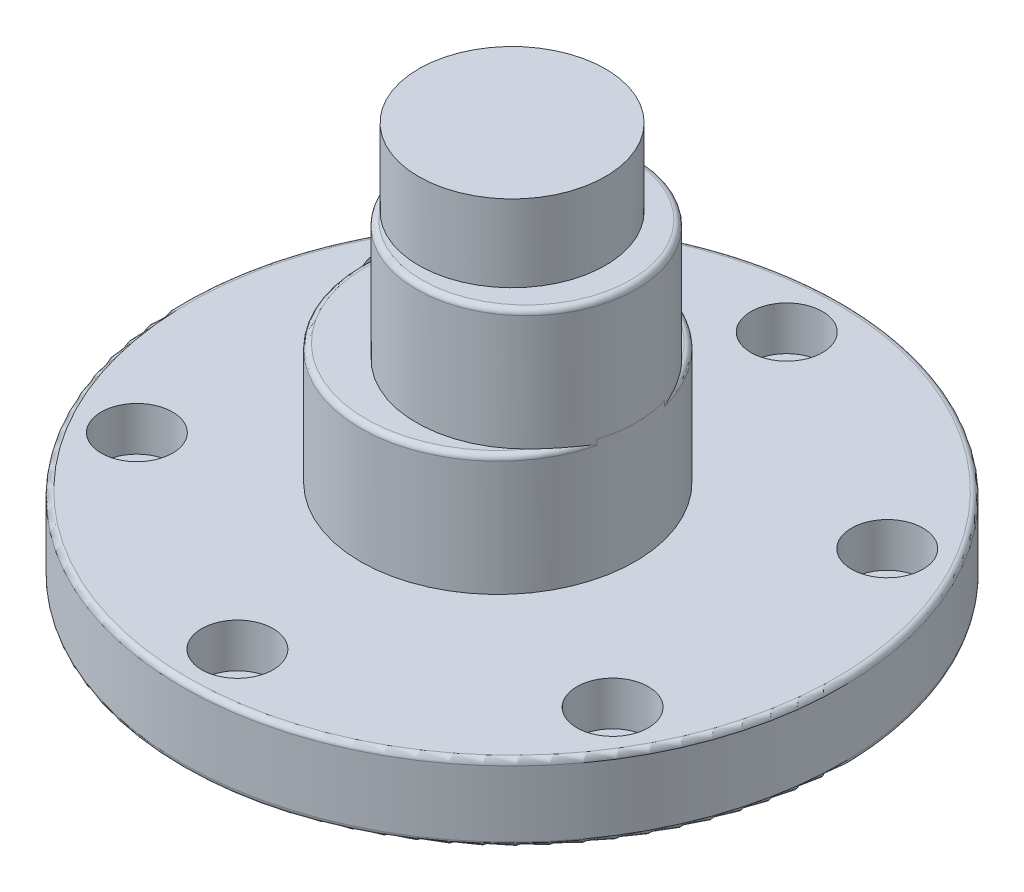
ISO-10303-21;
HEADER;
FILE_DESCRIPTION(('STEP AP214'),'2;1');
FILE_NAME('part.step','',(''),(''),'','','');
FILE_SCHEMA(('AUTOMOTIVE_DESIGN { 1 0 10303 214 1 1 1 1 }'));
ENDSEC;
DATA;
#1=APPLICATION_CONTEXT('core data for automotive mechanical design processes');
#2=APPLICATION_PROTOCOL_DEFINITION('international standard','automotive_design',2000,#1);
#3=PRODUCT_CONTEXT('',#1,'mechanical');
#4=PRODUCT('Part','Part','',(#3));
#5=PRODUCT_RELATED_PRODUCT_CATEGORY('part','',(#4));
#6=PRODUCT_DEFINITION_FORMATION('','',#4);
#7=PRODUCT_DEFINITION_CONTEXT('part definition',#1,'design');
#8=PRODUCT_DEFINITION('design','',#6,#7);
#9=PRODUCT_DEFINITION_SHAPE('','',#8);
#10=(LENGTH_UNIT() NAMED_UNIT(*) SI_UNIT(.MILLI.,.METRE.));
#11=(NAMED_UNIT(*) PLANE_ANGLE_UNIT() SI_UNIT($,.RADIAN.));
#12=(NAMED_UNIT(*) SI_UNIT($,.STERADIAN.) SOLID_ANGLE_UNIT());
#13=UNCERTAINTY_MEASURE_WITH_UNIT(LENGTH_MEASURE(1.E-05),#10,'distance_accuracy_value','');
#14=(GEOMETRIC_REPRESENTATION_CONTEXT(3) GLOBAL_UNCERTAINTY_ASSIGNED_CONTEXT((#13)) GLOBAL_UNIT_ASSIGNED_CONTEXT((#10,
#11,#12)) REPRESENTATION_CONTEXT('',''));
#15=CARTESIAN_POINT('',(0.,0.,0.));
#16=DIRECTION('',(0.,0.,1.));
#17=DIRECTION('',(1.,0.,0.));
#18=AXIS2_PLACEMENT_3D('',#15,#16,#17);
#19=CARTESIAN_POINT('',(0.,7.,-25.));
#20=DIRECTION('',(0.,-1.,0.));
#21=DIRECTION('',(0.,0.,-1.));
#22=AXIS2_PLACEMENT_3D('',#19,#20,#21);
#23=CYLINDRICAL_SURFACE('',#22,2.05);
#24=CARTESIAN_POINT('',(0.,0.,-25.));
#25=DIRECTION('',(0.,1.,0.));
#26=DIRECTION('',(0.,0.,1.));
#27=AXIS2_PLACEMENT_3D('',#24,#25,#26);
#28=CIRCLE('',#27,2.05);
#29=CARTESIAN_POINT('',(0.,0.,-22.95));
#30=VERTEX_POINT('',#29);
#31=EDGE_CURVE('E154',#30,#30,#28,.T.);
#32=ORIENTED_EDGE('',*,*,#31,.F.);
#33=EDGE_LOOP('',(#32));
#34=FACE_BOUND('',#33,.T.);
#35=CARTESIAN_POINT('',(0.,3.,-25.));
#36=DIRECTION('',(0.,1.,0.));
#37=DIRECTION('',(0.,0.,1.));
#38=AXIS2_PLACEMENT_3D('',#35,#36,#37);
#39=CIRCLE('',#38,2.05);
#40=CARTESIAN_POINT('',(0.,3.,-22.95));
#41=VERTEX_POINT('',#40);
#42=EDGE_CURVE('E36',#41,#41,#39,.T.);
#43=ORIENTED_EDGE('',*,*,#42,.T.);
#44=EDGE_LOOP('',(#43));
#45=FACE_BOUND('',#44,.T.);
#46=ADVANCED_FACE('F32',(#34,#45),#23,.F.);
#47=CARTESIAN_POINT('',(21.6506350946115,7.,-12.5000000000009));
#48=DIRECTION('',(0.,-1.,0.));
#49=DIRECTION('',(0.,0.,-1.));
#50=AXIS2_PLACEMENT_3D('',#47,#48,#49);
#51=CYLINDRICAL_SURFACE('',#50,2.05);
#52=CARTESIAN_POINT('',(21.6506350946115,0.,-12.5000000000009));
#53=DIRECTION('',(0.,1.,0.));
#54=DIRECTION('',(0.,0.,1.));
#55=AXIS2_PLACEMENT_3D('',#52,#53,#54);
#56=CIRCLE('',#55,2.05);
#57=CARTESIAN_POINT('',(21.6506350946115,0.,-10.4500000000009));
#58=VERTEX_POINT('',#57);
#59=EDGE_CURVE('E151',#58,#58,#56,.T.);
#60=ORIENTED_EDGE('',*,*,#59,.F.);
#61=EDGE_LOOP('',(#60));
#62=FACE_BOUND('',#61,.T.);
#63=CARTESIAN_POINT('',(21.6506350946115,3.,-12.5000000000009));
#64=DIRECTION('',(0.,1.,0.));
#65=DIRECTION('',(0.,0.,1.));
#66=AXIS2_PLACEMENT_3D('',#63,#64,#65);
#67=CIRCLE('',#66,2.05);
#68=CARTESIAN_POINT('',(21.6506350946115,3.,-10.4500000000009));
#69=VERTEX_POINT('',#68);
#70=EDGE_CURVE('E279',#69,#69,#67,.T.);
#71=ORIENTED_EDGE('',*,*,#70,.T.);
#72=EDGE_LOOP('',(#71));
#73=FACE_BOUND('',#72,.T.);
#74=ADVANCED_FACE('F213',(#62,#73),#51,.F.);
#75=CARTESIAN_POINT('',(21.6506350946126,7.,12.4999999999991));
#76=DIRECTION('',(0.,-1.,0.));
#77=DIRECTION('',(0.,0.,-1.));
#78=AXIS2_PLACEMENT_3D('',#75,#76,#77);
#79=CYLINDRICAL_SURFACE('',#78,2.05);
#80=CARTESIAN_POINT('',(21.6506350946126,0.,12.4999999999991));
#81=DIRECTION('',(0.,1.,0.));
#82=DIRECTION('',(0.,0.,1.));
#83=AXIS2_PLACEMENT_3D('',#80,#81,#82);
#84=CIRCLE('',#83,2.05);
#85=CARTESIAN_POINT('',(21.6506350946126,0.,14.5499999999991));
#86=VERTEX_POINT('',#85);
#87=EDGE_CURVE('E148',#86,#86,#84,.T.);
#88=ORIENTED_EDGE('',*,*,#87,.F.);
#89=EDGE_LOOP('',(#88));
#90=FACE_BOUND('',#89,.T.);
#91=CARTESIAN_POINT('',(21.6506350946126,3.,12.4999999999991));
#92=DIRECTION('',(0.,1.,0.));
#93=DIRECTION('',(0.,0.,1.));
#94=AXIS2_PLACEMENT_3D('',#91,#92,#93);
#95=CIRCLE('',#94,2.05);
#96=CARTESIAN_POINT('',(21.6506350946126,3.,14.5499999999991));
#97=VERTEX_POINT('',#96);
#98=EDGE_CURVE('E277',#97,#97,#95,.T.);
#99=ORIENTED_EDGE('',*,*,#98,.T.);
#100=EDGE_LOOP('',(#99));
#101=FACE_BOUND('',#100,.T.);
#102=ADVANCED_FACE('F219',(#90,#101),#79,.F.);
#103=CARTESIAN_POINT('',(2.1224433562867E-12,7.,25.));
#104=DIRECTION('',(0.,-1.,0.));
#105=DIRECTION('',(0.,0.,-1.));
#106=AXIS2_PLACEMENT_3D('',#103,#104,#105);
#107=CYLINDRICAL_SURFACE('',#106,2.05);
#108=CARTESIAN_POINT('',(2.1224433562867E-12,0.,25.));
#109=DIRECTION('',(0.,1.,0.));
#110=DIRECTION('',(0.,0.,1.));
#111=AXIS2_PLACEMENT_3D('',#108,#109,#110);
#112=CIRCLE('',#111,2.05);
#113=CARTESIAN_POINT('',(2.1224433562867E-12,0.,27.05));
#114=VERTEX_POINT('',#113);
#115=EDGE_CURVE('E145',#114,#114,#112,.T.);
#116=ORIENTED_EDGE('',*,*,#115,.F.);
#117=EDGE_LOOP('',(#116));
#118=FACE_BOUND('',#117,.T.);
#119=CARTESIAN_POINT('',(2.1224433562867E-12,3.,25.));
#120=DIRECTION('',(0.,1.,0.));
#121=DIRECTION('',(0.,0.,1.));
#122=AXIS2_PLACEMENT_3D('',#119,#120,#121);
#123=CIRCLE('',#122,2.05);
#124=CARTESIAN_POINT('',(2.1224433562867E-12,3.,27.05));
#125=VERTEX_POINT('',#124);
#126=EDGE_CURVE('E280',#125,#125,#123,.T.);
#127=ORIENTED_EDGE('',*,*,#126,.T.);
#128=EDGE_LOOP('',(#127));
#129=FACE_BOUND('',#128,.T.);
#130=ADVANCED_FACE('F265',(#118,#129),#107,.F.);
#131=CARTESIAN_POINT('',(-21.6506350946094,7.,12.5000000000009));
#132=DIRECTION('',(0.,-1.,0.));
#133=DIRECTION('',(0.,0.,-1.));
#134=AXIS2_PLACEMENT_3D('',#131,#132,#133);
#135=CYLINDRICAL_SURFACE('',#134,2.05);
#136=CARTESIAN_POINT('',(-21.6506350946094,0.,12.5000000000009));
#137=DIRECTION('',(0.,1.,0.));
#138=DIRECTION('',(0.,0.,1.));
#139=AXIS2_PLACEMENT_3D('',#136,#137,#138);
#140=CIRCLE('',#139,2.05);
#141=CARTESIAN_POINT('',(-21.6506350946094,0.,14.5500000000009));
#142=VERTEX_POINT('',#141);
#143=EDGE_CURVE('E142',#142,#142,#140,.T.);
#144=ORIENTED_EDGE('',*,*,#143,.F.);
#145=EDGE_LOOP('',(#144));
#146=FACE_BOUND('',#145,.T.);
#147=CARTESIAN_POINT('',(-21.6506350946094,3.,12.5000000000009));
#148=DIRECTION('',(0.,1.,0.));
#149=DIRECTION('',(0.,0.,1.));
#150=AXIS2_PLACEMENT_3D('',#147,#148,#149);
#151=CIRCLE('',#150,2.05);
#152=CARTESIAN_POINT('',(-21.6506350946094,3.,14.5500000000009));
#153=VERTEX_POINT('',#152);
#154=EDGE_CURVE('E284',#153,#153,#151,.T.);
#155=ORIENTED_EDGE('',*,*,#154,.T.);
#156=EDGE_LOOP('',(#155));
#157=FACE_BOUND('',#156,.T.);
#158=ADVANCED_FACE('F261',(#146,#157),#135,.F.);
#159=CARTESIAN_POINT('',(-21.6506350946104,7.,-12.4999999999991));
#160=DIRECTION('',(0.,-1.,0.));
#161=DIRECTION('',(0.,0.,-1.));
#162=AXIS2_PLACEMENT_3D('',#159,#160,#161);
#163=CYLINDRICAL_SURFACE('',#162,2.05);
#164=CARTESIAN_POINT('',(-21.6506350946104,0.,-12.4999999999991));
#165=DIRECTION('',(0.,1.,0.));
#166=DIRECTION('',(0.,0.,1.));
#167=AXIS2_PLACEMENT_3D('',#164,#165,#166);
#168=CIRCLE('',#167,2.05);
#169=CARTESIAN_POINT('',(-21.6506350946104,0.,-10.4499999999991));
#170=VERTEX_POINT('',#169);
#171=EDGE_CURVE('E137',#170,#170,#168,.T.);
#172=ORIENTED_EDGE('',*,*,#171,.F.);
#173=EDGE_LOOP('',(#172));
#174=FACE_BOUND('',#173,.T.);
#175=CARTESIAN_POINT('',(-21.6506350946104,3.,-12.4999999999991));
#176=DIRECTION('',(0.,1.,0.));
#177=DIRECTION('',(0.,0.,1.));
#178=AXIS2_PLACEMENT_3D('',#175,#176,#177);
#179=CIRCLE('',#178,2.05);
#180=CARTESIAN_POINT('',(-21.6506350946104,3.,-10.4499999999991));
#181=VERTEX_POINT('',#180);
#182=EDGE_CURVE('E98',#181,#181,#179,.T.);
#183=ORIENTED_EDGE('',*,*,#182,.T.);
#184=EDGE_LOOP('',(#183));
#185=FACE_BOUND('',#184,.T.);
#186=ADVANCED_FACE('F230',(#174,#185),#163,.F.);
#187=CARTESIAN_POINT('',(0.,7.,0.));
#188=DIRECTION('',(0.,1.,0.));
#189=DIRECTION('',(0.,0.,1.));
#190=AXIS2_PLACEMENT_3D('',#187,#188,#189);
#191=PLANE('',#190);
#192=CARTESIAN_POINT('',(0.,7.,-25.));
#193=DIRECTION('',(0.,1.,0.));
#194=DIRECTION('',(0.,0.,1.));
#195=AXIS2_PLACEMENT_3D('',#192,#193,#194);
#196=CIRCLE('',#195,3.25);
#197=CARTESIAN_POINT('',(0.,7.,-21.75));
#198=VERTEX_POINT('',#197);
#199=EDGE_CURVE('E99',#198,#198,#196,.T.);
#200=ORIENTED_EDGE('',*,*,#199,.F.);
#201=EDGE_LOOP('',(#200));
#202=FACE_BOUND('',#201,.T.);
#203=CARTESIAN_POINT('',(-21.6506350946104,7.,-12.4999999999991));
#204=DIRECTION('',(0.,1.,0.));
#205=DIRECTION('',(0.,0.,1.));
#206=AXIS2_PLACEMENT_3D('',#203,#204,#205);
#207=CIRCLE('',#206,3.25);
#208=CARTESIAN_POINT('',(-21.6506350946104,7.,-9.24999999999906));
#209=VERTEX_POINT('',#208);
#210=EDGE_CURVE('E92',#209,#209,#207,.T.);
#211=ORIENTED_EDGE('',*,*,#210,.F.);
#212=EDGE_LOOP('',(#211));
#213=FACE_BOUND('',#212,.T.);
#214=CARTESIAN_POINT('',(-21.6506350946094,7.,12.5000000000009));
#215=DIRECTION('',(0.,1.,0.));
#216=DIRECTION('',(0.,0.,1.));
#217=AXIS2_PLACEMENT_3D('',#214,#215,#216);
#218=CIRCLE('',#217,3.25);
#219=CARTESIAN_POINT('',(-21.6506350946094,7.,15.7500000000009));
#220=VERTEX_POINT('',#219);
#221=EDGE_CURVE('E106',#220,#220,#218,.T.);
#222=ORIENTED_EDGE('',*,*,#221,.F.);
#223=EDGE_LOOP('',(#222));
#224=FACE_BOUND('',#223,.T.);
#225=CARTESIAN_POINT('',(2.1224433562867E-12,7.,25.));
#226=DIRECTION('',(0.,1.,0.));
#227=DIRECTION('',(0.,0.,1.));
#228=AXIS2_PLACEMENT_3D('',#225,#226,#227);
#229=CIRCLE('',#228,3.25);
#230=CARTESIAN_POINT('',(2.1224433562867E-12,7.,28.25));
#231=VERTEX_POINT('',#230);
#232=EDGE_CURVE('E123',#231,#231,#229,.T.);
#233=ORIENTED_EDGE('',*,*,#232,.F.);
#234=EDGE_LOOP('',(#233));
#235=FACE_BOUND('',#234,.T.);
#236=CARTESIAN_POINT('',(21.6506350946126,7.,12.4999999999991));
#237=DIRECTION('',(0.,1.,0.));
#238=DIRECTION('',(0.,0.,1.));
#239=AXIS2_PLACEMENT_3D('',#236,#237,#238);
#240=CIRCLE('',#239,3.25);
#241=CARTESIAN_POINT('',(21.6506350946126,7.,15.7499999999991));
#242=VERTEX_POINT('',#241);
#243=EDGE_CURVE('E117',#242,#242,#240,.T.);
#244=ORIENTED_EDGE('',*,*,#243,.F.);
#245=EDGE_LOOP('',(#244));
#246=FACE_BOUND('',#245,.T.);
#247=CARTESIAN_POINT('',(21.6506350946115,7.,-12.5000000000009));
#248=DIRECTION('',(0.,1.,0.));
#249=DIRECTION('',(0.,0.,1.));
#250=AXIS2_PLACEMENT_3D('',#247,#248,#249);
#251=CIRCLE('',#250,3.25);
#252=CARTESIAN_POINT('',(21.6506350946115,7.,-9.25000000000092));
#253=VERTEX_POINT('',#252);
#254=EDGE_CURVE('E111',#253,#253,#251,.T.);
#255=ORIENTED_EDGE('',*,*,#254,.F.);
#256=EDGE_LOOP('',(#255));
#257=FACE_BOUND('',#256,.T.);
#258=CARTESIAN_POINT('',(0.,7.,0.));
#259=DIRECTION('',(0.,1.,0.));
#260=DIRECTION('',(0.,0.,1.));
#261=AXIS2_PLACEMENT_3D('',#258,#259,#260);
#262=CIRCLE('',#261,29.5);
#263=CARTESIAN_POINT('',(0.,7.,29.5));
#264=VERTEX_POINT('',#263);
#265=EDGE_CURVE('E177',#264,#264,#262,.T.);
#266=ORIENTED_EDGE('',*,*,#265,.T.);
#267=EDGE_LOOP('',(#266));
#268=FACE_BOUND('',#267,.T.);
#269=CARTESIAN_POINT('',(-1.3,7.,0.));
#270=DIRECTION('',(0.,1.,0.));
#271=DIRECTION('',(0.,0.,1.));
#272=AXIS2_PLACEMENT_3D('',#269,#270,#271);
#273=CIRCLE('',#272,12.5);
#274=CARTESIAN_POINT('',(-1.3,7.,12.5));
#275=VERTEX_POINT('',#274);
#276=EDGE_CURVE('E133',#275,#275,#273,.T.);
#277=ORIENTED_EDGE('',*,*,#276,.F.);
#278=EDGE_LOOP('',(#277));
#279=FACE_BOUND('',#278,.T.);
#280=ADVANCED_FACE('F226',(#202,#213,#224,#235,#246,#257,#268,#279),#191,.T.);
#281=CARTESIAN_POINT('',(0.,0.,0.));
#282=DIRECTION('',(0.,1.,0.));
#283=DIRECTION('',(0.,0.,1.));
#284=AXIS2_PLACEMENT_3D('',#281,#282,#283);
#285=PLANE('',#284);
#286=CARTESIAN_POINT('',(0.,0.,0.));
#287=DIRECTION('',(0.,1.,0.));
#288=DIRECTION('',(0.,0.,1.));
#289=AXIS2_PLACEMENT_3D('',#286,#287,#288);
#290=CIRCLE('',#289,29.5);
#291=CARTESIAN_POINT('',(0.,0.,29.5));
#292=VERTEX_POINT('',#291);
#293=EDGE_CURVE('E174',#292,#292,#290,.F.);
#294=ORIENTED_EDGE('',*,*,#293,.T.);
#295=EDGE_LOOP('',(#294));
#296=FACE_BOUND('',#295,.T.);
#297=ORIENTED_EDGE('',*,*,#31,.T.);
#298=EDGE_LOOP('',(#297));
#299=FACE_BOUND('',#298,.T.);
#300=ORIENTED_EDGE('',*,*,#59,.T.);
#301=EDGE_LOOP('',(#300));
#302=FACE_BOUND('',#301,.T.);
#303=ORIENTED_EDGE('',*,*,#87,.T.);
#304=EDGE_LOOP('',(#303));
#305=FACE_BOUND('',#304,.T.);
#306=ORIENTED_EDGE('',*,*,#115,.T.);
#307=EDGE_LOOP('',(#306));
#308=FACE_BOUND('',#307,.T.);
#309=ORIENTED_EDGE('',*,*,#143,.T.);
#310=EDGE_LOOP('',(#309));
#311=FACE_BOUND('',#310,.T.);
#312=ORIENTED_EDGE('',*,*,#171,.T.);
#313=EDGE_LOOP('',(#312));
#314=FACE_BOUND('',#313,.T.);
#315=ADVANCED_FACE('F229',(#296,#299,#302,#305,#308,#311,#314),#285,.F.);
#316=CARTESIAN_POINT('',(0.,7.,0.));
#317=DIRECTION('',(0.,-1.,0.));
#318=DIRECTION('',(0.,0.,-1.));
#319=AXIS2_PLACEMENT_3D('',#316,#317,#318);
#320=CYLINDRICAL_SURFACE('',#319,30.);
#321=CARTESIAN_POINT('',(0.,0.5,0.));
#322=DIRECTION('',(0.,1.,0.));
#323=DIRECTION('',(0.,0.,1.));
#324=AXIS2_PLACEMENT_3D('',#321,#322,#323);
#325=CIRCLE('',#324,30.);
#326=CARTESIAN_POINT('',(0.,0.5,30.));
#327=VERTEX_POINT('',#326);
#328=EDGE_CURVE('E171',#327,#327,#325,.T.);
#329=ORIENTED_EDGE('',*,*,#328,.T.);
#330=EDGE_LOOP('',(#329));
#331=FACE_BOUND('',#330,.T.);
#332=CARTESIAN_POINT('',(0.,6.5,0.));
#333=DIRECTION('',(0.,1.,0.));
#334=DIRECTION('',(0.,0.,1.));
#335=AXIS2_PLACEMENT_3D('',#332,#333,#334);
#336=CIRCLE('',#335,30.);
#337=CARTESIAN_POINT('',(0.,6.5,30.));
#338=VERTEX_POINT('',#337);
#339=EDGE_CURVE('E168',#338,#338,#336,.F.);
#340=ORIENTED_EDGE('',*,*,#339,.T.);
#341=EDGE_LOOP('',(#340));
#342=FACE_BOUND('',#341,.T.);
#343=ADVANCED_FACE('F233',(#331,#342),#320,.T.);
#344=CARTESIAN_POINT('',(-1.3,18.,0.));
#345=DIRECTION('',(0.,-1.,0.));
#346=DIRECTION('',(0.,0.,-1.));
#347=AXIS2_PLACEMENT_3D('',#344,#345,#346);
#348=CYLINDRICAL_SURFACE('',#347,12.5);
#349=CARTESIAN_POINT('',(-1.3,18.,0.));
#350=DIRECTION('',(0.,1.,0.));
#351=DIRECTION('',(0.,0.,1.));
#352=AXIS2_PLACEMENT_3D('',#349,#350,#351);
#353=CIRCLE('',#352,12.5);
#354=CARTESIAN_POINT('',(10.8173076923077,18.,3.06934101884121));
#355=VERTEX_POINT('',#354);
#356=CARTESIAN_POINT('',(10.8173076923077,18.,-3.06934101884121));
#357=VERTEX_POINT('',#356);
#358=EDGE_CURVE('E134',#355,#357,#353,.T.);
#359=ORIENTED_EDGE('',*,*,#358,.F.);
#360=DIRECTION('',(0.,-1.,0.));
#361=VECTOR('',#360,1.);
#362=CARTESIAN_POINT('',(10.8173076923077,18.,3.06934101884121));
#363=LINE('',#362,#361);
#364=CARTESIAN_POINT('',(10.8173076923077,17.5,3.06934101884119));
#365=VERTEX_POINT('',#364);
#366=EDGE_CURVE('E56',#355,#365,#363,.T.);
#367=ORIENTED_EDGE('',*,*,#366,.T.);
#368=CARTESIAN_POINT('',(-1.3,17.5,0.));
#369=DIRECTION('',(0.,1.,0.));
#370=DIRECTION('',(0.,0.,1.));
#371=AXIS2_PLACEMENT_3D('',#368,#369,#370);
#372=CIRCLE('',#371,12.5);
#373=CARTESIAN_POINT('',(10.8173076923077,17.5,-3.06934101884119));
#374=VERTEX_POINT('',#373);
#375=EDGE_CURVE('E164',#365,#374,#372,.F.);
#376=ORIENTED_EDGE('',*,*,#375,.T.);
#377=DIRECTION('',(0.,-1.,0.));
#378=VECTOR('',#377,1.);
#379=CARTESIAN_POINT('',(10.8173076923077,17.5,-3.06934101884119));
#380=LINE('',#379,#378);
#381=EDGE_CURVE('E162',#374,#357,#380,.F.);
#382=ORIENTED_EDGE('',*,*,#381,.T.);
#383=EDGE_LOOP('',(#359,#367,#376,#382));
#384=FACE_BOUND('',#383,.T.);
#385=ORIENTED_EDGE('',*,*,#276,.T.);
#386=EDGE_LOOP('',(#385));
#387=FACE_BOUND('',#386,.T.);
#388=ADVANCED_FACE('F236',(#384,#387),#348,.T.);
#389=CARTESIAN_POINT('',(-1.3,18.,0.));
#390=DIRECTION('',(0.,1.,0.));
#391=DIRECTION('',(0.,0.,1.));
#392=AXIS2_PLACEMENT_3D('',#389,#390,#391);
#393=PLANE('',#392);
#394=CARTESIAN_POINT('',(1.3,18.,0.));
#395=DIRECTION('',(0.,1.,0.));
#396=DIRECTION('',(0.,0.,1.));
#397=AXIS2_PLACEMENT_3D('',#394,#395,#396);
#398=CIRCLE('',#397,10.);
#399=CARTESIAN_POINT('',(8.46153846153844,18.,-6.97942453672978));
#400=VERTEX_POINT('',#399);
#401=CARTESIAN_POINT('',(8.46153846153844,18.,6.97942453672978));
#402=VERTEX_POINT('',#401);
#403=EDGE_CURVE('E77',#400,#402,#398,.T.);
#404=ORIENTED_EDGE('',*,*,#403,.F.);
#405=CARTESIAN_POINT('',(-1.3,18.,0.));
#406=DIRECTION('',(0.,1.,0.));
#407=DIRECTION('',(0.,0.,1.));
#408=AXIS2_PLACEMENT_3D('',#405,#406,#407);
#409=CIRCLE('',#408,12.);
#410=EDGE_CURVE('E159',#400,#402,#409,.T.);
#411=ORIENTED_EDGE('',*,*,#410,.T.);
#412=EDGE_LOOP('',(#404,#411));
#413=FACE_BOUND('',#412,.T.);
#414=ADVANCED_FACE('F241',(#413),#393,.T.);
#415=CARTESIAN_POINT('',(1.3,18.,0.));
#416=DIRECTION('',(0.,1.,0.));
#417=DIRECTION('',(0.,0.,1.));
#418=AXIS2_PLACEMENT_3D('',#415,#416,#417);
#419=PLANE('',#418);
#420=EDGE_CURVE('E131',#355,#357,#398,.T.);
#421=ORIENTED_EDGE('',*,*,#420,.F.);
#422=ORIENTED_EDGE('',*,*,#358,.T.);
#423=EDGE_LOOP('',(#421,#422));
#424=FACE_BOUND('',#423,.T.);
#425=ADVANCED_FACE('F256',(#424),#419,.F.);
#426=CARTESIAN_POINT('',(1.3,29.,0.));
#427=DIRECTION('',(0.,-1.,0.));
#428=DIRECTION('',(0.,0.,-1.));
#429=AXIS2_PLACEMENT_3D('',#426,#427,#428);
#430=CYLINDRICAL_SURFACE('',#429,10.);
#431=CARTESIAN_POINT('',(1.3,28.5,0.));
#432=DIRECTION('',(0.,1.,0.));
#433=DIRECTION('',(0.,0.,1.));
#434=AXIS2_PLACEMENT_3D('',#431,#432,#433);
#435=CIRCLE('',#434,10.);
#436=CARTESIAN_POINT('',(1.3,28.5,10.));
#437=VERTEX_POINT('',#436);
#438=EDGE_CURVE('E88',#437,#437,#435,.F.);
#439=ORIENTED_EDGE('',*,*,#438,.T.);
#440=EDGE_LOOP('',(#439));
#441=FACE_BOUND('',#440,.T.);
#442=ORIENTED_EDGE('',*,*,#420,.T.);
#443=ORIENTED_EDGE('',*,*,#381,.F.);
#444=CARTESIAN_POINT('',(10.8173076923077,17.5,-3.06934101884119));
#445=CARTESIAN_POINT('',(10.8173095584702,17.5019943107514,-3.06933518017795));
#446=CARTESIAN_POINT('',(10.8172504100137,17.5039800149307,-3.06951864069492));
#447=CARTESIAN_POINT('',(10.8170278792074,17.5078618840055,-3.07020855248681));
#448=CARTESIAN_POINT('',(10.8168659213839,17.5097588980156,-3.07071058953351));
#449=CARTESIAN_POINT('',(10.8163886169071,17.5140406312835,-3.07218951545217));
#450=CARTESIAN_POINT('',(10.8160406942725,17.516386041416,-3.07326718305668));
#451=CARTESIAN_POINT('',(10.8152352396496,17.5208798743549,-3.07576008372952));
#452=CARTESIAN_POINT('',(10.8147770424149,17.5230269877373,-3.07717736533071));
#453=CARTESIAN_POINT('',(10.8133646634133,17.5288819001703,-3.08154205523521));
#454=CARTESIAN_POINT('',(10.812320652658,17.5323597547914,-3.0847638779142));
#455=CARTESIAN_POINT('',(10.810097134182,17.5388302661798,-3.09161220731366));
#456=CARTESIAN_POINT('',(10.808917281229,17.5418216379314,-3.09523974442615));
#457=CARTESIAN_POINT('',(10.8024210831474,17.5569720718341,-3.11516887789488));
#458=CARTESIAN_POINT('',(10.7964680656663,17.5663308846776,-3.13328125986753));
#459=CARTESIAN_POINT('',(10.7841892345253,17.5830857718066,-3.17026130612908));
#460=CARTESIAN_POINT('',(10.7778601633619,17.5904602102016,-3.18913490318061));
#461=CARTESIAN_POINT('',(10.7587392371831,17.6106122229481,-3.2455802219716));
#462=CARTESIAN_POINT('',(10.7455939739687,17.6217528575725,-3.28365277274386));
#463=CARTESIAN_POINT('',(10.7186796216656,17.6421700215163,-3.36007974640486));
#464=CARTESIAN_POINT('',(10.7049092997665,17.6514426517236,-3.39843458915495));
#465=CARTESIAN_POINT('',(10.6768771351516,17.66873902765,-3.4750287596474));
#466=CARTESIAN_POINT('',(10.6626181646477,17.6767689148086,-3.51326767572238));
#467=CARTESIAN_POINT('',(10.6335934660633,17.6920213181758,-3.58966627133988));
#468=CARTESIAN_POINT('',(10.6188281990835,17.6992445447832,-3.62782599108829));
#469=CARTESIAN_POINT('',(10.5736950938042,17.7200684011327,-3.74236865353202));
#470=CARTESIAN_POINT('',(10.5425632870805,17.7327807573374,-3.81861456969872));
#471=CARTESIAN_POINT('',(10.4783335962342,17.7566913225852,-3.97051619156651));
#472=CARTESIAN_POINT('',(10.4452354193898,17.7678893053755,-4.04617180748706));
#473=CARTESIAN_POINT('',(10.3429986295483,17.7998247763736,-4.2721801045342));
#474=CARTESIAN_POINT('',(10.2709587743757,17.818886305628,-4.42147004231714));
#475=CARTESIAN_POINT('',(10.1191960215609,17.8539426047005,-4.71693203819472));
#476=CARTESIAN_POINT('',(10.0394538877442,17.8699293815134,-4.86309511504995));
#477=CARTESIAN_POINT('',(9.8726671038927,17.8991806185751,-5.15141769263566));
#478=CARTESIAN_POINT('',(9.78562467445576,17.9124459024449,-5.2935783933578));
#479=CARTESIAN_POINT('',(9.60533199165602,17.9362508101979,-5.57213727266747));
#480=CARTESIAN_POINT('',(9.51215171612889,17.9468161146771,-5.70857856309546));
#481=CARTESIAN_POINT('',(9.31904677698939,17.9653028801095,-5.9768052764459));
#482=CARTESIAN_POINT('',(9.2191215881212,17.9732241348727,-6.10859033554706));
#483=CARTESIAN_POINT('',(9.01313604427898,17.9861905355917,-6.36668608186828));
#484=CARTESIAN_POINT('',(8.9070978735921,17.9912454389505,-6.49301397232669));
#485=CARTESIAN_POINT('',(8.68886493893499,17.998134597449,-6.74031891564234));
#486=CARTESIAN_POINT('',(8.57667033906715,17.9999689383913,-6.86129611096968));
#487=CARTESIAN_POINT('',(8.46153846153845,18.,-6.97942453672978));
#488=B_SPLINE_CURVE_WITH_KNOTS('',3,(#444,#445,#446,#447,#448,#449,#450,#451,#452,#453,#454,
#455,#456,#457,#458,#459,#460,#461,#462,#463,#464,#465,#466,#467,#468,#469,#470,#471,#472,#473,
#474,#475,#476,#477,#478,#479,#480,#481,#482,#483,#484,#485,#486,#487),.UNSPECIFIED.,.F.,.F.,(4,
2,2,2,2,2,2,2,2,2,2,2,2,2,2,2,2,2,2,2,2,4),(0.,0.00595977866179287,0.0118387292775862,
0.0196079771204624,0.0274253236684394,0.0419069614666543,0.0564262512629261,0.119506727898623,
0.183249413005848,0.308385966094485,0.433781072154473,0.558535217149805,0.683178614209353,
0.933118079238803,1.18309484496503,1.68338788088616,2.18496438303771,2.68638886558979,
3.18284991906197,3.67934967882475,4.1741489881888,4.66893511485592),.UNSPECIFIED.);
#489=EDGE_CURVE('E11',#374,#400,#488,.T.);
#490=ORIENTED_EDGE('',*,*,#489,.T.);
#491=ORIENTED_EDGE('',*,*,#403,.T.);
#492=CARTESIAN_POINT('',(8.46153846153844,18.,6.97942453672978));
#493=CARTESIAN_POINT('',(8.57801385481817,17.9999675940587,6.85991766396974));
#494=CARTESIAN_POINT('',(8.69148184144877,17.9980908838404,6.73749643554392));
#495=CARTESIAN_POINT('',(8.91227020249425,17.991041274209,6.4870044842873));
#496=CARTESIAN_POINT('',(9.01958145205811,17.9858636133696,6.35892584977152));
#497=CARTESIAN_POINT('',(9.23357912661217,17.9722248894378,6.09011657819159));
#498=CARTESIAN_POINT('',(9.33987308301002,17.9635917884265,5.94908219224604));
#499=CARTESIAN_POINT('',(9.5447527739194,17.9433275022319,5.66173004031633));
#500=CARTESIAN_POINT('',(9.64333845615557,17.9316962967186,5.51541223851136));
#501=CARTESIAN_POINT('',(9.8324804618802,17.9055253645109,5.21802783695377));
#502=CARTESIAN_POINT('',(9.92304067141839,17.8909870567059,5.06696358403354));
#503=CARTESIAN_POINT('',(10.0959139867914,17.8588231285826,4.76054976455549));
#504=CARTESIAN_POINT('',(10.1782288769709,17.8411981785141,4.6052011344875));
#505=CARTESIAN_POINT('',(10.3303172505488,17.8032246705511,4.29895859618104));
#506=CARTESIAN_POINT('',(10.4005210835759,17.7830662906193,4.14825540127191));
#507=CARTESIAN_POINT('',(10.5115516497394,17.7449825776206,3.8935661371199));
#508=CARTESIAN_POINT('',(10.554514642762,17.7284580686574,3.7903024698649));
#509=CARTESIAN_POINT('',(10.6233179288176,17.6974121498171,3.61681984874468));
#510=CARTESIAN_POINT('',(10.6501721156344,17.683995636601,3.54680960282093));
#511=CARTESIAN_POINT('',(10.6936247463407,17.6587656411918,3.42962741909989));
#512=CARTESIAN_POINT('',(10.7107128160029,17.6478552182291,3.38244994408645));
#513=CARTESIAN_POINT('',(10.7385713841622,17.6272552983455,3.30371082022243));
#514=CARTESIAN_POINT('',(10.7495939027202,17.618316827447,3.27204540339101));
#515=CARTESIAN_POINT('',(10.7676601675031,17.6013638007811,3.21930378667765));
#516=CARTESIAN_POINT('',(10.774845940058,17.5939727461094,3.19808936075522));
#517=CARTESIAN_POINT('',(10.7866293919216,17.5798433023457,3.16292464906008));
#518=CARTESIAN_POINT('',(10.7913290496771,17.5736332431895,3.14879198694448));
#519=CARTESIAN_POINT('',(10.8001453170566,17.5600418129603,3.12208540011129));
#520=CARTESIAN_POINT('',(10.8042798297758,17.552769263718,3.1094709137655));
#521=CARTESIAN_POINT('',(10.8089960990437,17.541600503507,3.09499651784532));
#522=CARTESIAN_POINT('',(10.809931877356,17.5392197108298,3.09211970954278));
#523=CARTESIAN_POINT('',(10.8117229639053,17.5341601823351,3.08660565254019));
#524=CARTESIAN_POINT('',(10.8125782830318,17.5314814869433,3.08396837142409));
#525=CARTESIAN_POINT('',(10.8139447271817,17.526521407504,3.0797498721871));
#526=CARTESIAN_POINT('',(10.8144863750004,17.5243285319827,3.07807595264933));
#527=CARTESIAN_POINT('',(10.8154652623687,17.519707994465,3.07504851218429));
#528=CARTESIAN_POINT('',(10.8159027217647,17.5172808423075,3.07369431666559));
#529=CARTESIAN_POINT('',(10.8165189134167,17.5129342028747,3.07178587683975));
#530=CARTESIAN_POINT('',(10.8167358919145,17.5110727775598,3.07111351809698));
#531=CARTESIAN_POINT('',(10.8170714762318,17.5072604723818,3.07007342521216));
#532=CARTESIAN_POINT('',(10.8171903819342,17.5053098846085,3.06970476244579));
#533=CARTESIAN_POINT('',(10.8172898875288,17.5022316443722,3.06939622422767));
#534=CARTESIAN_POINT('',(10.8173081827545,17.5011159276381,3.06933948657753));
#535=CARTESIAN_POINT('',(10.8173076923077,17.5,3.06934101884123));
#536=B_SPLINE_CURVE_WITH_KNOTS('',3,(#492,#493,#494,#495,#496,#497,#498,#499,#500,#501,#502,
#503,#504,#505,#506,#507,#508,#509,#510,#511,#512,#513,#514,#515,#516,#517,#518,#519,#520,#521,
#522,#523,#524,#525,#526,#527,#528,#529,#530,#531,#532,#533,#534,#535),.UNSPECIFIED.,.F.,.F.,(4,
2,2,2,2,2,2,2,2,2,2,2,2,2,2,2,2,2,2,2,2,4),(0.,0.500554949850395,1.00183355929199,
1.53200301598884,2.06217606783457,2.59209098331235,3.12189097261966,3.62403767032735,
3.96310983882517,4.19157692047455,4.34557032177041,4.44963634592882,4.52031774225713,
4.56872492923564,4.6138294538859,4.62536533334421,4.63689964927837,4.64531414732263,
4.653710729556,4.65966150717398,4.66559402058414,4.66894038667346),.UNSPECIFIED.);
#537=EDGE_CURVE('E41',#402,#365,#536,.T.);
#538=ORIENTED_EDGE('',*,*,#537,.T.);
#539=ORIENTED_EDGE('',*,*,#366,.F.);
#540=EDGE_LOOP('',(#442,#443,#490,#491,#538,#539));
#541=FACE_BOUND('',#540,.T.);
#542=ADVANCED_FACE('F191',(#441,#541),#430,.T.);
#543=CARTESIAN_POINT('',(1.3,29.,0.));
#544=DIRECTION('',(0.,1.,0.));
#545=DIRECTION('',(0.,0.,1.));
#546=AXIS2_PLACEMENT_3D('',#543,#544,#545);
#547=PLANE('',#546);
#548=CARTESIAN_POINT('',(1.3,29.,0.));
#549=DIRECTION('',(0.,1.,0.));
#550=DIRECTION('',(0.,0.,1.));
#551=AXIS2_PLACEMENT_3D('',#548,#549,#550);
#552=CIRCLE('',#551,9.50000000000001);
#553=CARTESIAN_POINT('',(-6.27307692307696,29.,5.73572191769784));
#554=VERTEX_POINT('',#553);
#555=CARTESIAN_POINT('',(-6.27307692307696,29.,-5.73572191769784));
#556=VERTEX_POINT('',#555);
#557=EDGE_CURVE('E48',#554,#556,#552,.T.);
#558=ORIENTED_EDGE('',*,*,#557,.T.);
#559=CARTESIAN_POINT('',(0.,29.,0.));
#560=DIRECTION('',(0.,1.,0.));
#561=DIRECTION('',(0.,0.,1.));
#562=AXIS2_PLACEMENT_3D('',#559,#560,#561);
#563=CIRCLE('',#562,8.5);
#564=EDGE_CURVE('E79',#554,#556,#563,.T.);
#565=ORIENTED_EDGE('',*,*,#564,.F.);
#566=EDGE_LOOP('',(#558,#565));
#567=FACE_BOUND('',#566,.T.);
#568=ADVANCED_FACE('F80',(#567),#547,.T.);
#569=CARTESIAN_POINT('',(1.3,28.5,0.));
#570=DIRECTION('',(0.,1.,0.));
#571=DIRECTION('',(0.,0.,1.));
#572=AXIS2_PLACEMENT_3D('',#569,#570,#571);
#573=TOROIDAL_SURFACE('',#572,9.50000000000001,0.5);
#574=ORIENTED_EDGE('',*,*,#438,.F.);
#575=EDGE_LOOP('',(#574));
#576=FACE_BOUND('',#575,.T.);
#577=EDGE_CURVE('E75',#556,#554,#552,.T.);
#578=ORIENTED_EDGE('',*,*,#577,.F.);
#579=ORIENTED_EDGE('',*,*,#557,.F.);
#580=EDGE_LOOP('',(#578,#579));
#581=FACE_BOUND('',#580,.T.);
#582=ADVANCED_FACE('F73',(#576,#581),#573,.T.);
#583=CARTESIAN_POINT('',(-1.3,17.5,0.));
#584=DIRECTION('',(0.,1.,0.));
#585=DIRECTION('',(0.,0.,1.));
#586=AXIS2_PLACEMENT_3D('',#583,#584,#585);
#587=TOROIDAL_SURFACE('',#586,12.,0.5);
#588=ORIENTED_EDGE('',*,*,#489,.F.);
#589=ORIENTED_EDGE('',*,*,#375,.F.);
#590=ORIENTED_EDGE('',*,*,#537,.F.);
#591=ORIENTED_EDGE('',*,*,#410,.F.);
#592=EDGE_LOOP('',(#588,#589,#590,#591));
#593=FACE_BOUND('',#592,.T.);
#594=ADVANCED_FACE('F195',(#593),#587,.T.);
#595=CARTESIAN_POINT('',(0.,0.5,0.));
#596=DIRECTION('',(0.,1.,0.));
#597=DIRECTION('',(0.,0.,1.));
#598=AXIS2_PLACEMENT_3D('',#595,#596,#597);
#599=TOROIDAL_SURFACE('',#598,29.5,0.5);
#600=ORIENTED_EDGE('',*,*,#293,.F.);
#601=EDGE_LOOP('',(#600));
#602=FACE_BOUND('',#601,.T.);
#603=ORIENTED_EDGE('',*,*,#328,.F.);
#604=EDGE_LOOP('',(#603));
#605=FACE_BOUND('',#604,.T.);
#606=ADVANCED_FACE('F199',(#602,#605),#599,.T.);
#607=CARTESIAN_POINT('',(0.,6.5,0.));
#608=DIRECTION('',(0.,1.,0.));
#609=DIRECTION('',(0.,0.,1.));
#610=AXIS2_PLACEMENT_3D('',#607,#608,#609);
#611=TOROIDAL_SURFACE('',#610,29.5,0.5);
#612=ORIENTED_EDGE('',*,*,#339,.F.);
#613=EDGE_LOOP('',(#612));
#614=FACE_BOUND('',#613,.T.);
#615=ORIENTED_EDGE('',*,*,#265,.F.);
#616=EDGE_LOOP('',(#615));
#617=FACE_BOUND('',#616,.T.);
#618=ADVANCED_FACE('F34',(#614,#617),#611,.T.);
#619=CARTESIAN_POINT('',(-21.6506350946104,3.,-12.4999999999991));
#620=DIRECTION('',(0.,1.,0.));
#621=DIRECTION('',(0.,0.,1.));
#622=AXIS2_PLACEMENT_3D('',#619,#620,#621);
#623=CYLINDRICAL_SURFACE('',#622,3.25);
#624=CARTESIAN_POINT('',(-21.6506350946104,3.,-12.4999999999991));
#625=DIRECTION('',(0.,1.,0.));
#626=DIRECTION('',(0.,0.,1.));
#627=AXIS2_PLACEMENT_3D('',#624,#625,#626);
#628=CIRCLE('',#627,3.25);
#629=CARTESIAN_POINT('',(-21.6506350946104,3.,-9.24999999999906));
#630=VERTEX_POINT('',#629);
#631=EDGE_CURVE('E103',#630,#630,#628,.T.);
#632=ORIENTED_EDGE('',*,*,#631,.F.);
#633=EDGE_LOOP('',(#632));
#634=FACE_BOUND('',#633,.T.);
#635=ORIENTED_EDGE('',*,*,#210,.T.);
#636=EDGE_LOOP('',(#635));
#637=FACE_BOUND('',#636,.T.);
#638=ADVANCED_FACE('F208',(#634,#637),#623,.F.);
#639=CARTESIAN_POINT('',(-21.6506350946104,3.,-12.4999999999991));
#640=DIRECTION('',(0.,1.,0.));
#641=DIRECTION('',(0.,0.,1.));
#642=AXIS2_PLACEMENT_3D('',#639,#640,#641);
#643=PLANE('',#642);
#644=ORIENTED_EDGE('',*,*,#182,.F.);
#645=EDGE_LOOP('',(#644));
#646=FACE_BOUND('',#645,.T.);
#647=ORIENTED_EDGE('',*,*,#631,.T.);
#648=EDGE_LOOP('',(#647));
#649=FACE_BOUND('',#648,.T.);
#650=ADVANCED_FACE('F292',(#646,#649),#643,.T.);
#651=CARTESIAN_POINT('',(-21.6506350946094,3.,12.5000000000009));
#652=DIRECTION('',(0.,1.,0.));
#653=DIRECTION('',(0.,0.,1.));
#654=AXIS2_PLACEMENT_3D('',#651,#652,#653);
#655=CYLINDRICAL_SURFACE('',#654,3.25);
#656=CARTESIAN_POINT('',(-21.6506350946094,3.,12.5000000000009));
#657=DIRECTION('',(0.,1.,0.));
#658=DIRECTION('',(0.,0.,1.));
#659=AXIS2_PLACEMENT_3D('',#656,#657,#658);
#660=CIRCLE('',#659,3.25);
#661=CARTESIAN_POINT('',(-21.6506350946094,3.,15.7500000000009));
#662=VERTEX_POINT('',#661);
#663=EDGE_CURVE('E126',#662,#662,#660,.T.);
#664=ORIENTED_EDGE('',*,*,#663,.F.);
#665=EDGE_LOOP('',(#664));
#666=FACE_BOUND('',#665,.T.);
#667=ORIENTED_EDGE('',*,*,#221,.T.);
#668=EDGE_LOOP('',(#667));
#669=FACE_BOUND('',#668,.T.);
#670=ADVANCED_FACE('F295',(#666,#669),#655,.F.);
#671=CARTESIAN_POINT('',(-21.6506350946094,3.,12.5000000000009));
#672=DIRECTION('',(0.,1.,0.));
#673=DIRECTION('',(0.,0.,1.));
#674=AXIS2_PLACEMENT_3D('',#671,#672,#673);
#675=PLANE('',#674);
#676=ORIENTED_EDGE('',*,*,#154,.F.);
#677=EDGE_LOOP('',(#676));
#678=FACE_BOUND('',#677,.T.);
#679=ORIENTED_EDGE('',*,*,#663,.T.);
#680=EDGE_LOOP('',(#679));
#681=FACE_BOUND('',#680,.T.);
#682=ADVANCED_FACE('F340',(#678,#681),#675,.T.);
#683=CARTESIAN_POINT('',(2.1224433562867E-12,3.,25.));
#684=DIRECTION('',(0.,1.,0.));
#685=DIRECTION('',(0.,0.,1.));
#686=AXIS2_PLACEMENT_3D('',#683,#684,#685);
#687=CYLINDRICAL_SURFACE('',#686,3.25);
#688=CARTESIAN_POINT('',(2.1224433562867E-12,3.,25.));
#689=DIRECTION('',(0.,1.,0.));
#690=DIRECTION('',(0.,0.,1.));
#691=AXIS2_PLACEMENT_3D('',#688,#689,#690);
#692=CIRCLE('',#691,3.25);
#693=CARTESIAN_POINT('',(2.1224433562867E-12,3.,28.25));
#694=VERTEX_POINT('',#693);
#695=EDGE_CURVE('E120',#694,#694,#692,.T.);
#696=ORIENTED_EDGE('',*,*,#695,.F.);
#697=EDGE_LOOP('',(#696));
#698=FACE_BOUND('',#697,.T.);
#699=ORIENTED_EDGE('',*,*,#232,.T.);
#700=EDGE_LOOP('',(#699));
#701=FACE_BOUND('',#700,.T.);
#702=ADVANCED_FACE('F336',(#698,#701),#687,.F.);
#703=CARTESIAN_POINT('',(2.1224433562867E-12,3.,25.));
#704=DIRECTION('',(0.,1.,0.));
#705=DIRECTION('',(0.,0.,1.));
#706=AXIS2_PLACEMENT_3D('',#703,#704,#705);
#707=PLANE('',#706);
#708=ORIENTED_EDGE('',*,*,#126,.F.);
#709=EDGE_LOOP('',(#708));
#710=FACE_BOUND('',#709,.T.);
#711=ORIENTED_EDGE('',*,*,#695,.T.);
#712=EDGE_LOOP('',(#711));
#713=FACE_BOUND('',#712,.T.);
#714=ADVANCED_FACE('F332',(#710,#713),#707,.T.);
#715=CARTESIAN_POINT('',(21.6506350946126,3.,12.4999999999991));
#716=DIRECTION('',(0.,1.,0.));
#717=DIRECTION('',(0.,0.,1.));
#718=AXIS2_PLACEMENT_3D('',#715,#716,#717);
#719=CYLINDRICAL_SURFACE('',#718,3.25);
#720=CARTESIAN_POINT('',(21.6506350946126,3.,12.4999999999991));
#721=DIRECTION('',(0.,1.,0.));
#722=DIRECTION('',(0.,0.,1.));
#723=AXIS2_PLACEMENT_3D('',#720,#721,#722);
#724=CIRCLE('',#723,3.25);
#725=CARTESIAN_POINT('',(21.6506350946126,3.,15.7499999999991));
#726=VERTEX_POINT('',#725);
#727=EDGE_CURVE('E114',#726,#726,#724,.T.);
#728=ORIENTED_EDGE('',*,*,#727,.F.);
#729=EDGE_LOOP('',(#728));
#730=FACE_BOUND('',#729,.T.);
#731=ORIENTED_EDGE('',*,*,#243,.T.);
#732=EDGE_LOOP('',(#731));
#733=FACE_BOUND('',#732,.T.);
#734=ADVANCED_FACE('F326',(#730,#733),#719,.F.);
#735=CARTESIAN_POINT('',(21.6506350946126,3.,12.4999999999991));
#736=DIRECTION('',(0.,1.,0.));
#737=DIRECTION('',(0.,0.,1.));
#738=AXIS2_PLACEMENT_3D('',#735,#736,#737);
#739=PLANE('',#738);
#740=ORIENTED_EDGE('',*,*,#98,.F.);
#741=EDGE_LOOP('',(#740));
#742=FACE_BOUND('',#741,.T.);
#743=ORIENTED_EDGE('',*,*,#727,.T.);
#744=EDGE_LOOP('',(#743));
#745=FACE_BOUND('',#744,.T.);
#746=ADVANCED_FACE('F316',(#742,#745),#739,.T.);
#747=CARTESIAN_POINT('',(21.6506350946115,3.,-12.5000000000009));
#748=DIRECTION('',(0.,1.,0.));
#749=DIRECTION('',(0.,0.,1.));
#750=AXIS2_PLACEMENT_3D('',#747,#748,#749);
#751=CYLINDRICAL_SURFACE('',#750,3.25);
#752=CARTESIAN_POINT('',(21.6506350946115,3.,-12.5000000000009));
#753=DIRECTION('',(0.,1.,0.));
#754=DIRECTION('',(0.,0.,1.));
#755=AXIS2_PLACEMENT_3D('',#752,#753,#754);
#756=CIRCLE('',#755,3.25);
#757=CARTESIAN_POINT('',(21.6506350946115,3.,-9.25000000000092));
#758=VERTEX_POINT('',#757);
#759=EDGE_CURVE('E102',#758,#758,#756,.T.);
#760=ORIENTED_EDGE('',*,*,#759,.F.);
#761=EDGE_LOOP('',(#760));
#762=FACE_BOUND('',#761,.T.);
#763=ORIENTED_EDGE('',*,*,#254,.T.);
#764=EDGE_LOOP('',(#763));
#765=FACE_BOUND('',#764,.T.);
#766=ADVANCED_FACE('F313',(#762,#765),#751,.F.);
#767=CARTESIAN_POINT('',(21.6506350946115,3.,-12.5000000000009));
#768=DIRECTION('',(0.,1.,0.));
#769=DIRECTION('',(0.,0.,1.));
#770=AXIS2_PLACEMENT_3D('',#767,#768,#769);
#771=PLANE('',#770);
#772=ORIENTED_EDGE('',*,*,#70,.F.);
#773=EDGE_LOOP('',(#772));
#774=FACE_BOUND('',#773,.T.);
#775=ORIENTED_EDGE('',*,*,#759,.T.);
#776=EDGE_LOOP('',(#775));
#777=FACE_BOUND('',#776,.T.);
#778=ADVANCED_FACE('F315',(#774,#777),#771,.T.);
#779=CARTESIAN_POINT('',(0.,3.,-25.));
#780=DIRECTION('',(0.,1.,0.));
#781=DIRECTION('',(0.,0.,1.));
#782=AXIS2_PLACEMENT_3D('',#779,#780,#781);
#783=CYLINDRICAL_SURFACE('',#782,3.25);
#784=CARTESIAN_POINT('',(0.,3.,-25.));
#785=DIRECTION('',(0.,1.,0.));
#786=DIRECTION('',(0.,0.,1.));
#787=AXIS2_PLACEMENT_3D('',#784,#785,#786);
#788=CIRCLE('',#787,3.25);
#789=CARTESIAN_POINT('',(0.,3.,-21.75));
#790=VERTEX_POINT('',#789);
#791=EDGE_CURVE('E95',#790,#790,#788,.T.);
#792=ORIENTED_EDGE('',*,*,#791,.F.);
#793=EDGE_LOOP('',(#792));
#794=FACE_BOUND('',#793,.T.);
#795=ORIENTED_EDGE('',*,*,#199,.T.);
#796=EDGE_LOOP('',(#795));
#797=FACE_BOUND('',#796,.T.);
#798=ADVANCED_FACE('F323',(#794,#797),#783,.F.);
#799=CARTESIAN_POINT('',(0.,3.,-25.));
#800=DIRECTION('',(0.,1.,0.));
#801=DIRECTION('',(0.,0.,1.));
#802=AXIS2_PLACEMENT_3D('',#799,#800,#801);
#803=PLANE('',#802);
#804=ORIENTED_EDGE('',*,*,#42,.F.);
#805=EDGE_LOOP('',(#804));
#806=FACE_BOUND('',#805,.T.);
#807=ORIENTED_EDGE('',*,*,#791,.T.);
#808=EDGE_LOOP('',(#807));
#809=FACE_BOUND('',#808,.T.);
#810=ADVANCED_FACE('F494',(#806,#809),#803,.T.);
#811=CARTESIAN_POINT('',(0.,36.,0.));
#812=DIRECTION('',(0.,-1.,0.));
#813=DIRECTION('',(0.,0.,-1.));
#814=AXIS2_PLACEMENT_3D('',#811,#812,#813);
#815=CYLINDRICAL_SURFACE('',#814,8.5);
#816=CARTESIAN_POINT('',(0.,36.,0.));
#817=DIRECTION('',(0.,1.,0.));
#818=DIRECTION('',(0.,0.,1.));
#819=AXIS2_PLACEMENT_3D('',#816,#817,#818);
#820=CIRCLE('',#819,8.5);
#821=CARTESIAN_POINT('',(0.,36.,8.5));
#822=VERTEX_POINT('',#821);
#823=EDGE_CURVE('E90',#822,#822,#820,.T.);
#824=ORIENTED_EDGE('',*,*,#823,.F.);
#825=EDGE_LOOP('',(#824));
#826=FACE_BOUND('',#825,.T.);
#827=EDGE_CURVE('E84',#556,#554,#563,.T.);
#828=ORIENTED_EDGE('',*,*,#827,.T.);
#829=ORIENTED_EDGE('',*,*,#564,.T.);
#830=EDGE_LOOP('',(#828,#829));
#831=FACE_BOUND('',#830,.T.);
#832=ADVANCED_FACE('F89',(#826,#831),#815,.T.);
#833=CARTESIAN_POINT('',(0.,36.,0.));
#834=DIRECTION('',(0.,1.,0.));
#835=DIRECTION('',(0.,0.,1.));
#836=AXIS2_PLACEMENT_3D('',#833,#834,#835);
#837=PLANE('',#836);
#838=ORIENTED_EDGE('',*,*,#823,.T.);
#839=EDGE_LOOP('',(#838));
#840=FACE_BOUND('',#839,.T.);
#841=ADVANCED_FACE('F542',(#840),#837,.T.);
#842=CARTESIAN_POINT('',(0.,29.,0.));
#843=DIRECTION('',(0.,1.,0.));
#844=DIRECTION('',(0.,0.,1.));
#845=AXIS2_PLACEMENT_3D('',#842,#843,#844);
#846=PLANE('',#845);
#847=ORIENTED_EDGE('',*,*,#577,.T.);
#848=ORIENTED_EDGE('',*,*,#827,.F.);
#849=EDGE_LOOP('',(#847,#848));
#850=FACE_BOUND('',#849,.T.);
#851=ADVANCED_FACE('F87',(#850),#846,.F.);
#852=CLOSED_SHELL('',(#46,#74,#102,#130,#158,#186,#280,#315,#343,#388,#414,#425,#542,#568,#582,
#594,#606,#618,#638,#650,#670,#682,#702,#714,#734,#746,#766,#778,#798,#810,#832,#841,#851));
#853=MANIFOLD_SOLID_BREP('B2',#852);
#854=ADVANCED_BREP_SHAPE_REPRESENTATION('',(#18,#853),#14);
#855=SHAPE_DEFINITION_REPRESENTATION(#9,#854);
ENDSEC;
END-ISO-10303-21;
